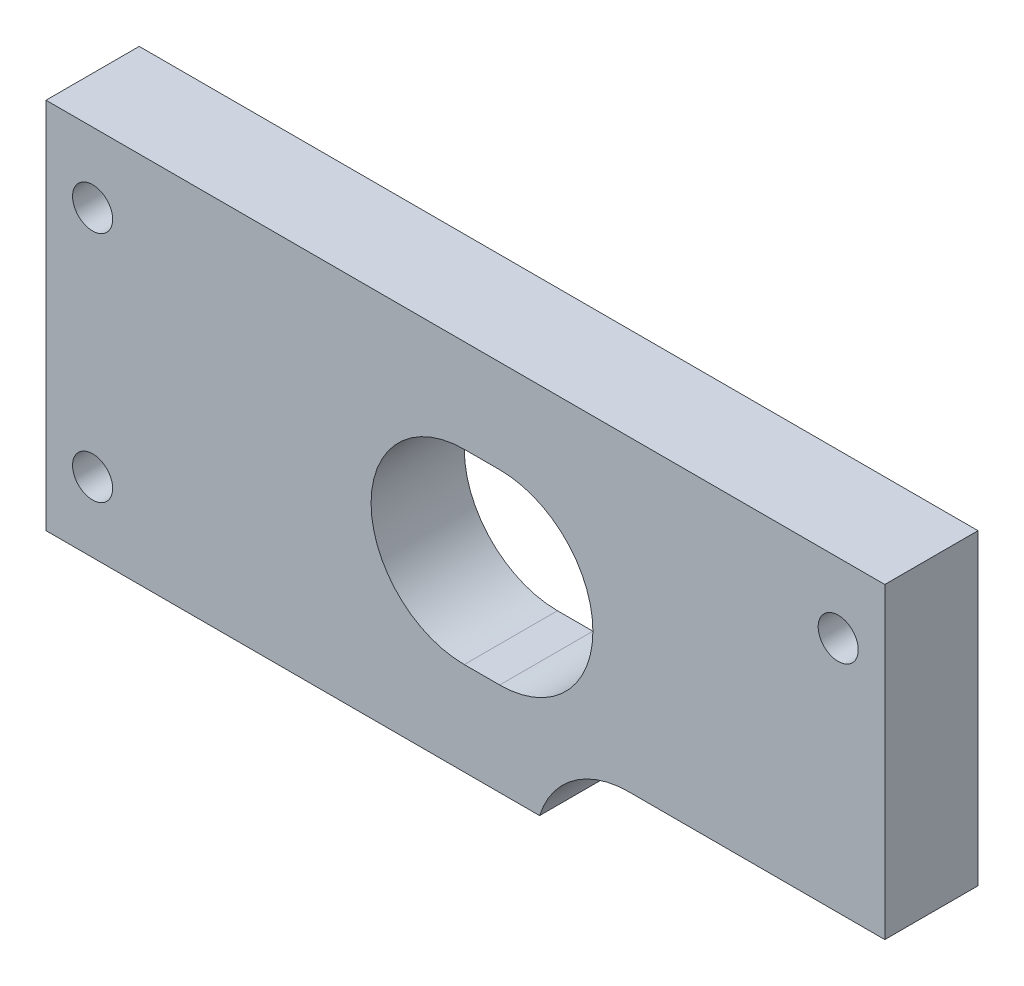
ISO-10303-21;
HEADER;
FILE_DESCRIPTION(('STEP AP214'),'2;1');
FILE_NAME('part.step','',(''),(''),'','','');
FILE_SCHEMA(('AUTOMOTIVE_DESIGN { 1 0 10303 214 1 1 1 1 }'));
ENDSEC;
DATA;
#1=APPLICATION_CONTEXT('core data for automotive mechanical design processes');
#2=APPLICATION_PROTOCOL_DEFINITION('international standard','automotive_design',2000,#1);
#3=PRODUCT_CONTEXT('',#1,'mechanical');
#4=PRODUCT('Part','Part','',(#3));
#5=PRODUCT_RELATED_PRODUCT_CATEGORY('part','',(#4));
#6=PRODUCT_DEFINITION_FORMATION('','',#4);
#7=PRODUCT_DEFINITION_CONTEXT('part definition',#1,'design');
#8=PRODUCT_DEFINITION('design','',#6,#7);
#9=PRODUCT_DEFINITION_SHAPE('','',#8);
#10=(LENGTH_UNIT() NAMED_UNIT(*) SI_UNIT(.MILLI.,.METRE.));
#11=(NAMED_UNIT(*) PLANE_ANGLE_UNIT() SI_UNIT($,.RADIAN.));
#12=(NAMED_UNIT(*) SI_UNIT($,.STERADIAN.) SOLID_ANGLE_UNIT());
#13=UNCERTAINTY_MEASURE_WITH_UNIT(LENGTH_MEASURE(1.E-05),#10,'distance_accuracy_value','');
#14=(GEOMETRIC_REPRESENTATION_CONTEXT(3) GLOBAL_UNCERTAINTY_ASSIGNED_CONTEXT((#13)) GLOBAL_UNIT_ASSIGNED_CONTEXT((#10,
#11,#12)) REPRESENTATION_CONTEXT('',''));
#15=CARTESIAN_POINT('',(0.,0.,0.));
#16=DIRECTION('',(0.,0.,1.));
#17=DIRECTION('',(1.,0.,0.));
#18=AXIS2_PLACEMENT_3D('',#15,#16,#17);
#19=CARTESIAN_POINT('',(60.96,23.7066666666666,10.414));
#20=DIRECTION('',(0.,-1.,0.));
#21=DIRECTION('',(0.,0.,-1.));
#22=AXIS2_PLACEMENT_3D('',#19,#20,#21);
#23=PLANE('',#22);
#24=DIRECTION('',(0.,0.,-1.));
#25=VECTOR('',#24,1.);
#26=CARTESIAN_POINT('',(13.9199721420049,23.7066666666666,10.414));
#27=LINE('',#26,#25);
#28=CARTESIAN_POINT('',(13.9199721420049,23.7066666666666,10.414));
#29=VERTEX_POINT('',#28);
#30=CARTESIAN_POINT('',(13.9199721420049,23.7066666666666,-2.286));
#31=VERTEX_POINT('',#30);
#32=EDGE_CURVE('E166',#29,#31,#27,.T.);
#33=ORIENTED_EDGE('',*,*,#32,.F.);
#34=DIRECTION('',(-1.,0.,0.));
#35=VECTOR('',#34,1.);
#36=CARTESIAN_POINT('',(60.96,23.7066666666666,10.414));
#37=LINE('',#36,#35);
#38=CARTESIAN_POINT('',(-53.34,23.7066666666666,10.414));
#39=VERTEX_POINT('',#38);
#40=EDGE_CURVE('E222',#29,#39,#37,.T.);
#41=ORIENTED_EDGE('',*,*,#40,.T.);
#42=DIRECTION('',(0.,0.,-1.));
#43=VECTOR('',#42,1.);
#44=CARTESIAN_POINT('',(-53.34,23.7066666666666,10.414));
#45=LINE('',#44,#43);
#46=CARTESIAN_POINT('',(-53.34,23.7066666666666,-2.286));
#47=VERTEX_POINT('',#46);
#48=EDGE_CURVE('E36',#39,#47,#45,.T.);
#49=ORIENTED_EDGE('',*,*,#48,.T.);
#50=DIRECTION('',(-1.,0.,0.));
#51=VECTOR('',#50,1.);
#52=CARTESIAN_POINT('',(60.96,23.7066666666666,-2.286));
#53=LINE('',#52,#51);
#54=EDGE_CURVE('E197',#31,#47,#53,.T.);
#55=ORIENTED_EDGE('',*,*,#54,.F.);
#56=EDGE_LOOP('',(#33,#41,#49,#55));
#57=FACE_BOUND('',#56,.T.);
#58=ADVANCED_FACE('F17',(#57),#23,.T.);
#59=CARTESIAN_POINT('',(60.96,74.5066666666666,10.414));
#60=DIRECTION('',(1.,0.,0.));
#61=DIRECTION('',(0.,1.,0.));
#62=AXIS2_PLACEMENT_3D('',#59,#60,#61);
#63=PLANE('',#62);
#64=DIRECTION('',(0.,0.,1.));
#65=VECTOR('',#64,1.);
#66=CARTESIAN_POINT('',(60.96,32.5966666666666,10.414));
#67=LINE('',#66,#65);
#68=CARTESIAN_POINT('',(60.96,32.5966666666666,-2.286));
#69=VERTEX_POINT('',#68);
#70=CARTESIAN_POINT('',(60.96,32.5966666666666,10.414));
#71=VERTEX_POINT('',#70);
#72=EDGE_CURVE('E173',#69,#71,#67,.T.);
#73=ORIENTED_EDGE('',*,*,#72,.F.);
#74=DIRECTION('',(0.,-1.,0.));
#75=VECTOR('',#74,1.);
#76=CARTESIAN_POINT('',(60.96,74.5066666666666,-2.286));
#77=LINE('',#76,#75);
#78=CARTESIAN_POINT('',(60.96,74.5066666666666,-2.286));
#79=VERTEX_POINT('',#78);
#80=EDGE_CURVE('E207',#79,#69,#77,.T.);
#81=ORIENTED_EDGE('',*,*,#80,.F.);
#82=DIRECTION('',(0.,0.,-1.));
#83=VECTOR('',#82,1.);
#84=CARTESIAN_POINT('',(60.96,74.5066666666666,10.414));
#85=LINE('',#84,#83);
#86=CARTESIAN_POINT('',(60.96,74.5066666666666,10.414));
#87=VERTEX_POINT('',#86);
#88=EDGE_CURVE('E11',#87,#79,#85,.T.);
#89=ORIENTED_EDGE('',*,*,#88,.F.);
#90=DIRECTION('',(0.,-1.,0.));
#91=VECTOR('',#90,1.);
#92=CARTESIAN_POINT('',(60.96,74.5066666666666,10.414));
#93=LINE('',#92,#91);
#94=EDGE_CURVE('E215',#87,#71,#93,.T.);
#95=ORIENTED_EDGE('',*,*,#94,.T.);
#96=EDGE_LOOP('',(#73,#81,#89,#95));
#97=FACE_BOUND('',#96,.T.);
#98=ADVANCED_FACE('F242',(#97),#63,.T.);
#99=CARTESIAN_POINT('',(-53.34,74.5066666666667,10.414));
#100=DIRECTION('',(0.,1.,0.));
#101=DIRECTION('',(1.,0.,0.));
#102=AXIS2_PLACEMENT_3D('',#99,#100,#101);
#103=PLANE('',#102);
#104=DIRECTION('',(1.,0.,0.));
#105=VECTOR('',#104,1.);
#106=CARTESIAN_POINT('',(-53.34,74.5066666666667,-2.286));
#107=LINE('',#106,#105);
#108=CARTESIAN_POINT('',(-53.34,74.5066666666667,-2.286));
#109=VERTEX_POINT('',#108);
#110=EDGE_CURVE('E202',#109,#79,#107,.T.);
#111=ORIENTED_EDGE('',*,*,#110,.F.);
#112=DIRECTION('',(0.,0.,-1.));
#113=VECTOR('',#112,1.);
#114=CARTESIAN_POINT('',(-53.34,74.5066666666667,10.414));
#115=LINE('',#114,#113);
#116=CARTESIAN_POINT('',(-53.34,74.5066666666667,10.414));
#117=VERTEX_POINT('',#116);
#118=EDGE_CURVE('E25',#117,#109,#115,.T.);
#119=ORIENTED_EDGE('',*,*,#118,.F.);
#120=DIRECTION('',(1.,0.,0.));
#121=VECTOR('',#120,1.);
#122=CARTESIAN_POINT('',(-53.34,74.5066666666667,10.414));
#123=LINE('',#122,#121);
#124=EDGE_CURVE('E214',#117,#87,#123,.T.);
#125=ORIENTED_EDGE('',*,*,#124,.T.);
#126=ORIENTED_EDGE('',*,*,#88,.T.);
#127=EDGE_LOOP('',(#111,#119,#125,#126));
#128=FACE_BOUND('',#127,.T.);
#129=ADVANCED_FACE('F237',(#128),#103,.T.);
#130=CARTESIAN_POINT('',(-53.34,23.7066666666666,10.414));
#131=DIRECTION('',(-1.,0.,0.));
#132=DIRECTION('',(0.,0.,1.));
#133=AXIS2_PLACEMENT_3D('',#130,#131,#132);
#134=PLANE('',#133);
#135=DIRECTION('',(0.,1.,0.));
#136=VECTOR('',#135,1.);
#137=CARTESIAN_POINT('',(-53.34,23.7066666666666,-2.286));
#138=LINE('',#137,#136);
#139=EDGE_CURVE('E203',#47,#109,#138,.T.);
#140=ORIENTED_EDGE('',*,*,#139,.F.);
#141=ORIENTED_EDGE('',*,*,#48,.F.);
#142=DIRECTION('',(0.,1.,0.));
#143=VECTOR('',#142,1.);
#144=CARTESIAN_POINT('',(-53.34,23.7066666666666,10.414));
#145=LINE('',#144,#143);
#146=EDGE_CURVE('E217',#39,#117,#145,.T.);
#147=ORIENTED_EDGE('',*,*,#146,.T.);
#148=ORIENTED_EDGE('',*,*,#118,.T.);
#149=EDGE_LOOP('',(#140,#141,#147,#148));
#150=FACE_BOUND('',#149,.T.);
#151=ADVANCED_FACE('F230',(#150),#134,.T.);
#152=CARTESIAN_POINT('',(0.,0.,10.414));
#153=DIRECTION('',(0.,0.,-1.));
#154=DIRECTION('',(0.,-1.,0.));
#155=AXIS2_PLACEMENT_3D('',#152,#153,#154);
#156=PLANE('',#155);
#157=CARTESIAN_POINT('',(54.61,64.9816666666667,10.414));
#158=DIRECTION('',(0.,0.,-1.));
#159=DIRECTION('',(-1.,0.,0.));
#160=AXIS2_PLACEMENT_3D('',#157,#158,#159);
#161=CIRCLE('',#160,2.7305);
#162=CARTESIAN_POINT('',(51.8795,64.9816666666667,10.414));
#163=VERTEX_POINT('',#162);
#164=EDGE_CURVE('E373',#163,#163,#161,.T.);
#165=ORIENTED_EDGE('',*,*,#164,.T.);
#166=EDGE_LOOP('',(#165));
#167=FACE_BOUND('',#166,.T.);
#168=CARTESIAN_POINT('',(-46.99,64.9816666666667,10.414));
#169=DIRECTION('',(0.,0.,-1.));
#170=DIRECTION('',(-1.,0.,0.));
#171=AXIS2_PLACEMENT_3D('',#168,#169,#170);
#172=CIRCLE('',#171,2.7305);
#173=CARTESIAN_POINT('',(-49.7205,64.9816666666667,10.414));
#174=VERTEX_POINT('',#173);
#175=EDGE_CURVE('E367',#174,#174,#172,.T.);
#176=ORIENTED_EDGE('',*,*,#175,.T.);
#177=EDGE_LOOP('',(#176));
#178=FACE_BOUND('',#177,.T.);
#179=CARTESIAN_POINT('',(-46.99,33.2316666666667,10.414));
#180=DIRECTION('',(0.,0.,-1.));
#181=DIRECTION('',(-1.,0.,0.));
#182=AXIS2_PLACEMENT_3D('',#179,#180,#181);
#183=CIRCLE('',#182,2.7305);
#184=CARTESIAN_POINT('',(-49.7205,33.2316666666667,10.414));
#185=VERTEX_POINT('',#184);
#186=EDGE_CURVE('E300',#185,#185,#183,.T.);
#187=ORIENTED_EDGE('',*,*,#186,.T.);
#188=EDGE_LOOP('',(#187));
#189=FACE_BOUND('',#188,.T.);
#190=DIRECTION('',(-1.,0.,0.));
#191=VECTOR('',#190,1.);
#192=CARTESIAN_POINT('',(3.65760000000005,36.4066666666667,10.414));
#193=LINE('',#192,#191);
#194=CARTESIAN_POINT('',(8.4836,36.4066666666667,10.414));
#195=VERTEX_POINT('',#194);
#196=CARTESIAN_POINT('',(3.65760000000005,36.4066666666667,10.414));
#197=VERTEX_POINT('',#196);
#198=EDGE_CURVE('E143',#195,#197,#193,.T.);
#199=ORIENTED_EDGE('',*,*,#198,.T.);
#200=CARTESIAN_POINT('',(3.65760000000008,49.1066666666667,10.414));
#201=DIRECTION('',(0.,0.,-1.));
#202=DIRECTION('',(-1.,0.,0.));
#203=AXIS2_PLACEMENT_3D('',#200,#201,#202);
#204=CIRCLE('',#203,12.7);
#205=CARTESIAN_POINT('',(3.65760000000011,61.8066666666667,10.414));
#206=VERTEX_POINT('',#205);
#207=EDGE_CURVE('E308',#197,#206,#204,.T.);
#208=ORIENTED_EDGE('',*,*,#207,.T.);
#209=DIRECTION('',(1.,0.,0.));
#210=VECTOR('',#209,1.);
#211=CARTESIAN_POINT('',(3.65760000000011,61.8066666666667,10.414));
#212=LINE('',#211,#210);
#213=CARTESIAN_POINT('',(8.48360000000012,61.8066666666666,10.414));
#214=VERTEX_POINT('',#213);
#215=EDGE_CURVE('E151',#206,#214,#212,.T.);
#216=ORIENTED_EDGE('',*,*,#215,.T.);
#217=CARTESIAN_POINT('',(8.4836,49.1066666666667,10.414));
#218=DIRECTION('',(0.,0.,-1.));
#219=DIRECTION('',(-1.,0.,0.));
#220=AXIS2_PLACEMENT_3D('',#217,#218,#219);
#221=CIRCLE('',#220,12.7);
#222=EDGE_CURVE('E134',#214,#195,#221,.T.);
#223=ORIENTED_EDGE('',*,*,#222,.T.);
#224=EDGE_LOOP('',(#199,#208,#216,#223));
#225=FACE_BOUND('',#224,.T.);
#226=CARTESIAN_POINT('',(26.035,19.8966666666667,10.414));
#227=DIRECTION('',(0.,0.,-1.));
#228=DIRECTION('',(-1.,0.,0.));
#229=AXIS2_PLACEMENT_3D('',#226,#227,#228);
#230=CIRCLE('',#229,12.7);
#231=CARTESIAN_POINT('',(26.035,32.5966666666666,10.414));
#232=VERTEX_POINT('',#231);
#233=EDGE_CURVE('E168',#29,#232,#230,.T.);
#234=ORIENTED_EDGE('',*,*,#233,.T.);
#235=DIRECTION('',(1.,0.,0.));
#236=VECTOR('',#235,1.);
#237=CARTESIAN_POINT('',(69.5763687194343,32.5966666666666,10.414));
#238=LINE('',#237,#236);
#239=EDGE_CURVE('E188',#232,#71,#238,.T.);
#240=ORIENTED_EDGE('',*,*,#239,.T.);
#241=ORIENTED_EDGE('',*,*,#94,.F.);
#242=ORIENTED_EDGE('',*,*,#124,.F.);
#243=ORIENTED_EDGE('',*,*,#146,.F.);
#244=ORIENTED_EDGE('',*,*,#40,.F.);
#245=EDGE_LOOP('',(#234,#240,#241,#242,#243,#244));
#246=FACE_BOUND('',#245,.T.);
#247=ADVANCED_FACE('F240',(#167,#178,#189,#225,#246),#156,.F.);
#248=CARTESIAN_POINT('',(0.,0.,-2.286));
#249=DIRECTION('',(0.,0.,-1.));
#250=DIRECTION('',(0.,-1.,0.));
#251=AXIS2_PLACEMENT_3D('',#248,#249,#250);
#252=PLANE('',#251);
#253=CARTESIAN_POINT('',(54.61,64.9816666666667,-2.286));
#254=DIRECTION('',(0.,0.,-1.));
#255=DIRECTION('',(-1.,0.,0.));
#256=AXIS2_PLACEMENT_3D('',#253,#254,#255);
#257=CIRCLE('',#256,4.572);
#258=CARTESIAN_POINT('',(50.038,64.9816666666667,-2.286));
#259=VERTEX_POINT('',#258);
#260=EDGE_CURVE('E428',#259,#259,#257,.T.);
#261=ORIENTED_EDGE('',*,*,#260,.F.);
#262=EDGE_LOOP('',(#261));
#263=FACE_BOUND('',#262,.T.);
#264=CARTESIAN_POINT('',(-46.99,64.9816666666667,-2.286));
#265=DIRECTION('',(0.,0.,-1.));
#266=DIRECTION('',(-1.,0.,0.));
#267=AXIS2_PLACEMENT_3D('',#264,#265,#266);
#268=CIRCLE('',#267,4.572);
#269=CARTESIAN_POINT('',(-51.562,64.9816666666667,-2.286));
#270=VERTEX_POINT('',#269);
#271=EDGE_CURVE('E362',#270,#270,#268,.T.);
#272=ORIENTED_EDGE('',*,*,#271,.F.);
#273=EDGE_LOOP('',(#272));
#274=FACE_BOUND('',#273,.T.);
#275=CARTESIAN_POINT('',(-46.99,33.2316666666667,-2.286));
#276=DIRECTION('',(0.,0.,-1.));
#277=DIRECTION('',(-1.,0.,0.));
#278=AXIS2_PLACEMENT_3D('',#275,#276,#277);
#279=CIRCLE('',#278,4.572);
#280=CARTESIAN_POINT('',(-51.562,33.2316666666667,-2.286));
#281=VERTEX_POINT('',#280);
#282=EDGE_CURVE('E299',#281,#281,#279,.T.);
#283=ORIENTED_EDGE('',*,*,#282,.F.);
#284=EDGE_LOOP('',(#283));
#285=FACE_BOUND('',#284,.T.);
#286=CARTESIAN_POINT('',(3.65760000000008,49.1066666666667,-2.286));
#287=DIRECTION('',(0.,0.,-1.));
#288=DIRECTION('',(-1.,0.,0.));
#289=AXIS2_PLACEMENT_3D('',#286,#287,#288);
#290=CIRCLE('',#289,12.7);
#291=CARTESIAN_POINT('',(3.65760000000005,36.4066666666667,-2.286));
#292=VERTEX_POINT('',#291);
#293=CARTESIAN_POINT('',(3.65760000000011,61.8066666666667,-2.286));
#294=VERTEX_POINT('',#293);
#295=EDGE_CURVE('E127',#292,#294,#290,.T.);
#296=ORIENTED_EDGE('',*,*,#295,.F.);
#297=DIRECTION('',(-1.,0.,0.));
#298=VECTOR('',#297,1.);
#299=CARTESIAN_POINT('',(3.65760000000005,36.4066666666667,-2.286));
#300=LINE('',#299,#298);
#301=CARTESIAN_POINT('',(8.4836,36.4066666666667,-2.286));
#302=VERTEX_POINT('',#301);
#303=EDGE_CURVE('E121',#302,#292,#300,.T.);
#304=ORIENTED_EDGE('',*,*,#303,.F.);
#305=CARTESIAN_POINT('',(8.4836,49.1066666666667,-2.286));
#306=DIRECTION('',(0.,0.,-1.));
#307=DIRECTION('',(-1.,0.,0.));
#308=AXIS2_PLACEMENT_3D('',#305,#306,#307);
#309=CIRCLE('',#308,12.7);
#310=CARTESIAN_POINT('',(8.48360000000012,61.8066666666666,-2.286));
#311=VERTEX_POINT('',#310);
#312=EDGE_CURVE('E130',#311,#302,#309,.T.);
#313=ORIENTED_EDGE('',*,*,#312,.F.);
#314=DIRECTION('',(1.,0.,0.));
#315=VECTOR('',#314,1.);
#316=CARTESIAN_POINT('',(3.65760000000011,61.8066666666667,-2.286));
#317=LINE('',#316,#315);
#318=EDGE_CURVE('E318',#294,#311,#317,.T.);
#319=ORIENTED_EDGE('',*,*,#318,.F.);
#320=EDGE_LOOP('',(#296,#304,#313,#319));
#321=FACE_BOUND('',#320,.T.);
#322=DIRECTION('',(1.,0.,0.));
#323=VECTOR('',#322,1.);
#324=CARTESIAN_POINT('',(69.5763687194343,32.5966666666666,-2.286));
#325=LINE('',#324,#323);
#326=CARTESIAN_POINT('',(26.035,32.5966666666666,-2.286));
#327=VERTEX_POINT('',#326);
#328=EDGE_CURVE('E193',#327,#69,#325,.T.);
#329=ORIENTED_EDGE('',*,*,#328,.F.);
#330=CARTESIAN_POINT('',(26.035,19.8966666666667,-2.286));
#331=DIRECTION('',(0.,0.,-1.));
#332=DIRECTION('',(-1.,0.,0.));
#333=AXIS2_PLACEMENT_3D('',#330,#331,#332);
#334=CIRCLE('',#333,12.7);
#335=EDGE_CURVE('E177',#31,#327,#334,.T.);
#336=ORIENTED_EDGE('',*,*,#335,.F.);
#337=ORIENTED_EDGE('',*,*,#54,.T.);
#338=ORIENTED_EDGE('',*,*,#139,.T.);
#339=ORIENTED_EDGE('',*,*,#110,.T.);
#340=ORIENTED_EDGE('',*,*,#80,.T.);
#341=EDGE_LOOP('',(#329,#336,#337,#338,#339,#340));
#342=FACE_BOUND('',#341,.T.);
#343=ADVANCED_FACE('F123',(#263,#274,#285,#321,#342),#252,.T.);
#344=CARTESIAN_POINT('',(69.5763687194343,32.5966666666666,10.414));
#345=DIRECTION('',(0.,1.,0.));
#346=DIRECTION('',(1.,0.,0.));
#347=AXIS2_PLACEMENT_3D('',#344,#345,#346);
#348=PLANE('',#347);
#349=ORIENTED_EDGE('',*,*,#72,.T.);
#350=ORIENTED_EDGE('',*,*,#239,.F.);
#351=DIRECTION('',(0.,0.,-1.));
#352=VECTOR('',#351,1.);
#353=CARTESIAN_POINT('',(26.035,32.5966666666666,10.414));
#354=LINE('',#353,#352);
#355=EDGE_CURVE('E175',#232,#327,#354,.T.);
#356=ORIENTED_EDGE('',*,*,#355,.T.);
#357=ORIENTED_EDGE('',*,*,#328,.T.);
#358=EDGE_LOOP('',(#349,#350,#356,#357));
#359=FACE_BOUND('',#358,.T.);
#360=ADVANCED_FACE('F244',(#359),#348,.F.);
#361=CARTESIAN_POINT('',(26.035,19.8966666666667,10.414));
#362=DIRECTION('',(0.,0.,-1.));
#363=DIRECTION('',(-1.,0.,0.));
#364=AXIS2_PLACEMENT_3D('',#361,#362,#363);
#365=CYLINDRICAL_SURFACE('',#364,12.7);
#366=ORIENTED_EDGE('',*,*,#32,.T.);
#367=ORIENTED_EDGE('',*,*,#335,.T.);
#368=ORIENTED_EDGE('',*,*,#355,.F.);
#369=ORIENTED_EDGE('',*,*,#233,.F.);
#370=EDGE_LOOP('',(#366,#367,#368,#369));
#371=FACE_BOUND('',#370,.T.);
#372=ADVANCED_FACE('F232',(#371),#365,.F.);
#373=CARTESIAN_POINT('',(3.65760000000005,36.4066666666667,10.414));
#374=DIRECTION('',(0.,-1.,0.));
#375=DIRECTION('',(-1.,0.,0.));
#376=AXIS2_PLACEMENT_3D('',#373,#374,#375);
#377=PLANE('',#376);
#378=ORIENTED_EDGE('',*,*,#303,.T.);
#379=DIRECTION('',(0.,0.,-1.));
#380=VECTOR('',#379,1.);
#381=CARTESIAN_POINT('',(3.65760000000005,36.4066666666667,10.414));
#382=LINE('',#381,#380);
#383=EDGE_CURVE('E133',#197,#292,#382,.T.);
#384=ORIENTED_EDGE('',*,*,#383,.F.);
#385=ORIENTED_EDGE('',*,*,#198,.F.);
#386=DIRECTION('',(0.,0.,-1.));
#387=VECTOR('',#386,1.);
#388=CARTESIAN_POINT('',(8.4836,36.4066666666667,10.414));
#389=LINE('',#388,#387);
#390=EDGE_CURVE('E138',#195,#302,#389,.T.);
#391=ORIENTED_EDGE('',*,*,#390,.T.);
#392=EDGE_LOOP('',(#378,#384,#385,#391));
#393=FACE_BOUND('',#392,.T.);
#394=ADVANCED_FACE('F137',(#393),#377,.F.);
#395=CARTESIAN_POINT('',(8.4836,49.1066666666667,10.414));
#396=DIRECTION('',(0.,0.,-1.));
#397=DIRECTION('',(-1.,0.,0.));
#398=AXIS2_PLACEMENT_3D('',#395,#396,#397);
#399=CYLINDRICAL_SURFACE('',#398,12.7);
#400=ORIENTED_EDGE('',*,*,#312,.T.);
#401=ORIENTED_EDGE('',*,*,#390,.F.);
#402=ORIENTED_EDGE('',*,*,#222,.F.);
#403=DIRECTION('',(0.,0.,-1.));
#404=VECTOR('',#403,1.);
#405=CARTESIAN_POINT('',(8.48360000000012,61.8066666666666,10.414));
#406=LINE('',#405,#404);
#407=EDGE_CURVE('E146',#214,#311,#406,.T.);
#408=ORIENTED_EDGE('',*,*,#407,.T.);
#409=EDGE_LOOP('',(#400,#401,#402,#408));
#410=FACE_BOUND('',#409,.T.);
#411=ADVANCED_FACE('F148',(#410),#399,.F.);
#412=CARTESIAN_POINT('',(3.65760000000011,61.8066666666667,10.414));
#413=DIRECTION('',(0.,1.,0.));
#414=DIRECTION('',(1.,0.,0.));
#415=AXIS2_PLACEMENT_3D('',#412,#413,#414);
#416=PLANE('',#415);
#417=ORIENTED_EDGE('',*,*,#318,.T.);
#418=ORIENTED_EDGE('',*,*,#407,.F.);
#419=ORIENTED_EDGE('',*,*,#215,.F.);
#420=DIRECTION('',(0.,0.,-1.));
#421=VECTOR('',#420,1.);
#422=CARTESIAN_POINT('',(3.65760000000011,61.8066666666667,10.414));
#423=LINE('',#422,#421);
#424=EDGE_CURVE('E321',#206,#294,#423,.T.);
#425=ORIENTED_EDGE('',*,*,#424,.T.);
#426=EDGE_LOOP('',(#417,#418,#419,#425));
#427=FACE_BOUND('',#426,.T.);
#428=ADVANCED_FACE('F327',(#427),#416,.F.);
#429=CARTESIAN_POINT('',(-44.2595,33.2316666666667,3.048));
#430=DIRECTION('',(0.,0.,1.));
#431=DIRECTION('',(1.,0.,0.));
#432=AXIS2_PLACEMENT_3D('',#429,#430,#431);
#433=PLANE('',#432);
#434=CARTESIAN_POINT('',(-46.99,33.2316666666667,3.048));
#435=DIRECTION('',(0.,0.,-1.));
#436=DIRECTION('',(-1.,0.,0.));
#437=AXIS2_PLACEMENT_3D('',#434,#435,#436);
#438=CIRCLE('',#437,2.7305);
#439=CARTESIAN_POINT('',(-49.7205,33.2316666666667,3.048));
#440=VERTEX_POINT('',#439);
#441=EDGE_CURVE('E292',#440,#440,#438,.T.);
#442=ORIENTED_EDGE('',*,*,#441,.F.);
#443=EDGE_LOOP('',(#442));
#444=FACE_BOUND('',#443,.T.);
#445=CARTESIAN_POINT('',(-46.99,33.2316666666667,3.048));
#446=DIRECTION('',(0.,0.,-1.));
#447=DIRECTION('',(-1.,0.,0.));
#448=AXIS2_PLACEMENT_3D('',#445,#446,#447);
#449=CIRCLE('',#448,4.572);
#450=CARTESIAN_POINT('',(-51.562,33.2316666666667,3.048));
#451=VERTEX_POINT('',#450);
#452=EDGE_CURVE('E310',#451,#451,#449,.T.);
#453=ORIENTED_EDGE('',*,*,#452,.T.);
#454=EDGE_LOOP('',(#453));
#455=FACE_BOUND('',#454,.T.);
#456=ADVANCED_FACE('F335',(#444,#455),#433,.F.);
#457=CARTESIAN_POINT('',(-44.2595,64.9816666666667,3.048));
#458=DIRECTION('',(0.,0.,1.));
#459=DIRECTION('',(1.,0.,0.));
#460=AXIS2_PLACEMENT_3D('',#457,#458,#459);
#461=PLANE('',#460);
#462=CARTESIAN_POINT('',(-46.99,64.9816666666667,3.048));
#463=DIRECTION('',(0.,0.,-1.));
#464=DIRECTION('',(-1.,0.,0.));
#465=AXIS2_PLACEMENT_3D('',#462,#463,#464);
#466=CIRCLE('',#465,2.7305);
#467=CARTESIAN_POINT('',(-49.7205,64.9816666666667,3.048));
#468=VERTEX_POINT('',#467);
#469=EDGE_CURVE('E356',#468,#468,#466,.T.);
#470=ORIENTED_EDGE('',*,*,#469,.F.);
#471=EDGE_LOOP('',(#470));
#472=FACE_BOUND('',#471,.T.);
#473=CARTESIAN_POINT('',(-46.99,64.9816666666667,3.048));
#474=DIRECTION('',(0.,0.,-1.));
#475=DIRECTION('',(-1.,0.,0.));
#476=AXIS2_PLACEMENT_3D('',#473,#474,#475);
#477=CIRCLE('',#476,4.572);
#478=CARTESIAN_POINT('',(-51.562,64.9816666666667,3.048));
#479=VERTEX_POINT('',#478);
#480=EDGE_CURVE('E357',#479,#479,#477,.T.);
#481=ORIENTED_EDGE('',*,*,#480,.T.);
#482=EDGE_LOOP('',(#481));
#483=FACE_BOUND('',#482,.T.);
#484=ADVANCED_FACE('F280',(#472,#483),#461,.F.);
#485=CARTESIAN_POINT('',(57.3405,64.9816666666667,3.048));
#486=DIRECTION('',(0.,0.,1.));
#487=DIRECTION('',(1.,0.,0.));
#488=AXIS2_PLACEMENT_3D('',#485,#486,#487);
#489=PLANE('',#488);
#490=CARTESIAN_POINT('',(54.61,64.9816666666667,3.048));
#491=DIRECTION('',(0.,0.,-1.));
#492=DIRECTION('',(-1.,0.,0.));
#493=AXIS2_PLACEMENT_3D('',#490,#491,#492);
#494=CIRCLE('',#493,2.7305);
#495=CARTESIAN_POINT('',(51.8795,64.9816666666667,3.048));
#496=VERTEX_POINT('',#495);
#497=EDGE_CURVE('E361',#496,#496,#494,.T.);
#498=ORIENTED_EDGE('',*,*,#497,.F.);
#499=EDGE_LOOP('',(#498));
#500=FACE_BOUND('',#499,.T.);
#501=CARTESIAN_POINT('',(54.61,64.9816666666667,3.048));
#502=DIRECTION('',(0.,0.,-1.));
#503=DIRECTION('',(-1.,0.,0.));
#504=AXIS2_PLACEMENT_3D('',#501,#502,#503);
#505=CIRCLE('',#504,4.572);
#506=CARTESIAN_POINT('',(50.038,64.9816666666667,3.048));
#507=VERTEX_POINT('',#506);
#508=EDGE_CURVE('E436',#507,#507,#505,.T.);
#509=ORIENTED_EDGE('',*,*,#508,.T.);
#510=EDGE_LOOP('',(#509));
#511=FACE_BOUND('',#510,.T.);
#512=ADVANCED_FACE('F273',(#500,#511),#489,.F.);
#513=CARTESIAN_POINT('',(3.65760000000008,49.1066666666667,10.414));
#514=DIRECTION('',(0.,0.,-1.));
#515=DIRECTION('',(-1.,0.,0.));
#516=AXIS2_PLACEMENT_3D('',#513,#514,#515);
#517=CYLINDRICAL_SURFACE('',#516,12.7);
#518=ORIENTED_EDGE('',*,*,#207,.F.);
#519=ORIENTED_EDGE('',*,*,#383,.T.);
#520=ORIENTED_EDGE('',*,*,#295,.T.);
#521=ORIENTED_EDGE('',*,*,#424,.F.);
#522=EDGE_LOOP('',(#518,#519,#520,#521));
#523=FACE_BOUND('',#522,.T.);
#524=ADVANCED_FACE('F277',(#523),#517,.F.);
#525=CARTESIAN_POINT('',(-46.99,33.2316666666667,-2.286));
#526=DIRECTION('',(0.,0.,-1.));
#527=DIRECTION('',(-1.,0.,0.));
#528=AXIS2_PLACEMENT_3D('',#525,#526,#527);
#529=CYLINDRICAL_SURFACE('',#528,2.7305);
#530=ORIENTED_EDGE('',*,*,#441,.T.);
#531=EDGE_LOOP('',(#530));
#532=FACE_BOUND('',#531,.T.);
#533=ORIENTED_EDGE('',*,*,#186,.F.);
#534=EDGE_LOOP('',(#533));
#535=FACE_BOUND('',#534,.T.);
#536=ADVANCED_FACE('F276',(#532,#535),#529,.F.);
#537=CARTESIAN_POINT('',(-46.99,33.2316666666667,-2.286));
#538=DIRECTION('',(0.,0.,-1.));
#539=DIRECTION('',(-1.,0.,0.));
#540=AXIS2_PLACEMENT_3D('',#537,#538,#539);
#541=CYLINDRICAL_SURFACE('',#540,4.572);
#542=ORIENTED_EDGE('',*,*,#282,.T.);
#543=EDGE_LOOP('',(#542));
#544=FACE_BOUND('',#543,.T.);
#545=ORIENTED_EDGE('',*,*,#452,.F.);
#546=EDGE_LOOP('',(#545));
#547=FACE_BOUND('',#546,.T.);
#548=ADVANCED_FACE('F281',(#544,#547),#541,.F.);
#549=CARTESIAN_POINT('',(-46.99,64.9816666666667,-2.286));
#550=DIRECTION('',(0.,0.,-1.));
#551=DIRECTION('',(-1.,0.,0.));
#552=AXIS2_PLACEMENT_3D('',#549,#550,#551);
#553=CYLINDRICAL_SURFACE('',#552,2.7305);
#554=ORIENTED_EDGE('',*,*,#469,.T.);
#555=EDGE_LOOP('',(#554));
#556=FACE_BOUND('',#555,.T.);
#557=ORIENTED_EDGE('',*,*,#175,.F.);
#558=EDGE_LOOP('',(#557));
#559=FACE_BOUND('',#558,.T.);
#560=ADVANCED_FACE('F290',(#556,#559),#553,.F.);
#561=CARTESIAN_POINT('',(-46.99,64.9816666666667,-2.286));
#562=DIRECTION('',(0.,0.,-1.));
#563=DIRECTION('',(-1.,0.,0.));
#564=AXIS2_PLACEMENT_3D('',#561,#562,#563);
#565=CYLINDRICAL_SURFACE('',#564,4.572);
#566=ORIENTED_EDGE('',*,*,#271,.T.);
#567=EDGE_LOOP('',(#566));
#568=FACE_BOUND('',#567,.T.);
#569=ORIENTED_EDGE('',*,*,#480,.F.);
#570=EDGE_LOOP('',(#569));
#571=FACE_BOUND('',#570,.T.);
#572=ADVANCED_FACE('F344',(#568,#571),#565,.F.);
#573=CARTESIAN_POINT('',(54.61,64.9816666666667,-2.286));
#574=DIRECTION('',(0.,0.,-1.));
#575=DIRECTION('',(-1.,0.,0.));
#576=AXIS2_PLACEMENT_3D('',#573,#574,#575);
#577=CYLINDRICAL_SURFACE('',#576,2.7305);
#578=ORIENTED_EDGE('',*,*,#497,.T.);
#579=EDGE_LOOP('',(#578));
#580=FACE_BOUND('',#579,.T.);
#581=ORIENTED_EDGE('',*,*,#164,.F.);
#582=EDGE_LOOP('',(#581));
#583=FACE_BOUND('',#582,.T.);
#584=ADVANCED_FACE('F345',(#580,#583),#577,.F.);
#585=CARTESIAN_POINT('',(54.61,64.9816666666667,-2.286));
#586=DIRECTION('',(0.,0.,-1.));
#587=DIRECTION('',(-1.,0.,0.));
#588=AXIS2_PLACEMENT_3D('',#585,#586,#587);
#589=CYLINDRICAL_SURFACE('',#588,4.572);
#590=ORIENTED_EDGE('',*,*,#260,.T.);
#591=EDGE_LOOP('',(#590));
#592=FACE_BOUND('',#591,.T.);
#593=ORIENTED_EDGE('',*,*,#508,.F.);
#594=EDGE_LOOP('',(#593));
#595=FACE_BOUND('',#594,.T.);
#596=ADVANCED_FACE('F597',(#592,#595),#589,.F.);
#597=CLOSED_SHELL('',(#58,#98,#129,#151,#247,#343,#360,#372,#394,#411,#428,#456,#484,#512,#524,
#536,#548,#560,#572,#584,#596));
#598=MANIFOLD_SOLID_BREP('B1',#597);
#599=ADVANCED_BREP_SHAPE_REPRESENTATION('',(#18,#598),#14);
#600=SHAPE_DEFINITION_REPRESENTATION(#9,#599);
ENDSEC;
END-ISO-10303-21;
